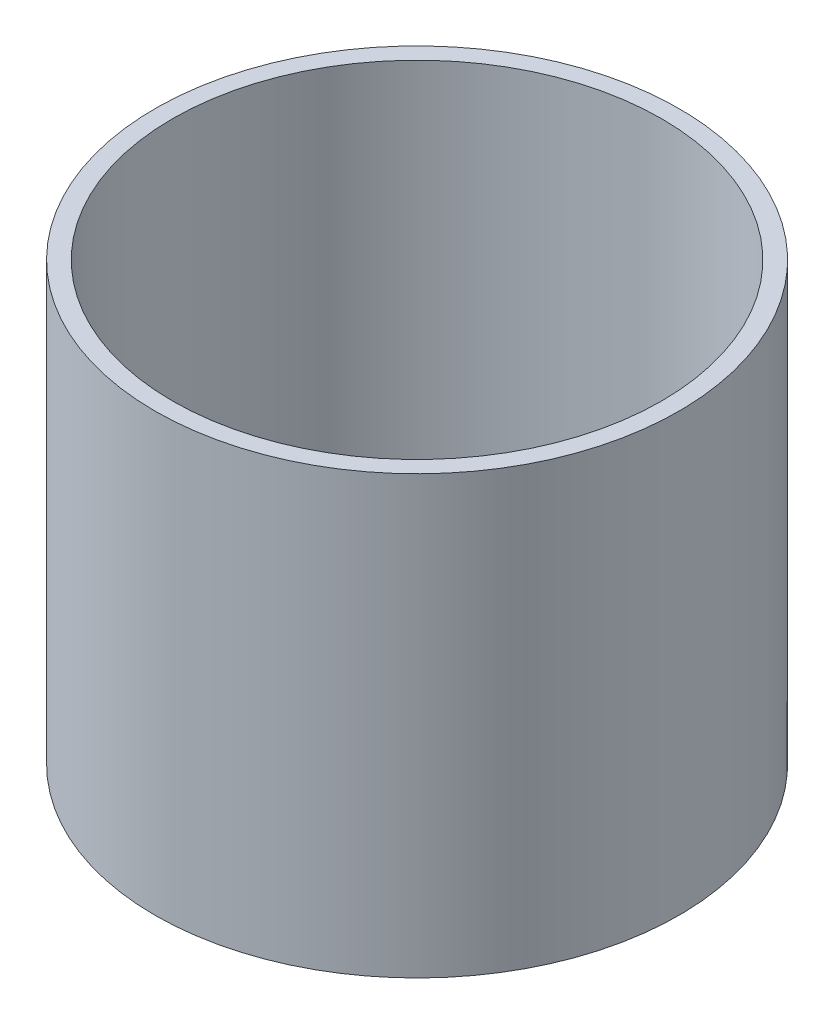
ISO-10303-21;
HEADER;
FILE_DESCRIPTION(('STEP AP214'),'2;1');
FILE_NAME('part.step','',(''),(''),'','','');
FILE_SCHEMA(('AUTOMOTIVE_DESIGN { 1 0 10303 214 1 1 1 1 }'));
ENDSEC;
DATA;
#1=APPLICATION_CONTEXT('core data for automotive mechanical design processes');
#2=APPLICATION_PROTOCOL_DEFINITION('international standard','automotive_design',2000,#1);
#3=PRODUCT_CONTEXT('',#1,'mechanical');
#4=PRODUCT('Part','Part','',(#3));
#5=PRODUCT_RELATED_PRODUCT_CATEGORY('part','',(#4));
#6=PRODUCT_DEFINITION_FORMATION('','',#4);
#7=PRODUCT_DEFINITION_CONTEXT('part definition',#1,'design');
#8=PRODUCT_DEFINITION('design','',#6,#7);
#9=PRODUCT_DEFINITION_SHAPE('','',#8);
#10=(LENGTH_UNIT() NAMED_UNIT(*) SI_UNIT(.MILLI.,.METRE.));
#11=(NAMED_UNIT(*) PLANE_ANGLE_UNIT() SI_UNIT($,.RADIAN.));
#12=(NAMED_UNIT(*) SI_UNIT($,.STERADIAN.) SOLID_ANGLE_UNIT());
#13=UNCERTAINTY_MEASURE_WITH_UNIT(LENGTH_MEASURE(1.E-05),#10,'distance_accuracy_value','');
#14=(GEOMETRIC_REPRESENTATION_CONTEXT(3) GLOBAL_UNCERTAINTY_ASSIGNED_CONTEXT((#13)) GLOBAL_UNIT_ASSIGNED_CONTEXT((#10,
#11,#12)) REPRESENTATION_CONTEXT('',''));
#15=CARTESIAN_POINT('',(0.,0.,0.));
#16=DIRECTION('',(0.,0.,1.));
#17=DIRECTION('',(1.,0.,0.));
#18=AXIS2_PLACEMENT_3D('',#15,#16,#17);
#19=CARTESIAN_POINT('',(0.,50.,0.));
#20=DIRECTION('',(0.,1.,0.));
#21=DIRECTION('',(0.,0.,1.));
#22=AXIS2_PLACEMENT_3D('',#19,#20,#21);
#23=PLANE('',#22);
#24=CARTESIAN_POINT('',(0.,50.,0.));
#25=DIRECTION('',(0.,1.,0.));
#26=DIRECTION('',(0.,0.,1.));
#27=AXIS2_PLACEMENT_3D('',#24,#25,#26);
#28=CIRCLE('',#27,30.);
#29=CARTESIAN_POINT('',(0.,50.,30.));
#30=VERTEX_POINT('',#29);
#31=EDGE_CURVE('E10',#30,#30,#28,.T.);
#32=ORIENTED_EDGE('',*,*,#31,.T.);
#33=EDGE_LOOP('',(#32));
#34=FACE_BOUND('',#33,.T.);
#35=CARTESIAN_POINT('',(0.,50.,0.));
#36=DIRECTION('',(0.,1.,0.));
#37=DIRECTION('',(0.,0.,1.));
#38=AXIS2_PLACEMENT_3D('',#35,#36,#37);
#39=CIRCLE('',#38,28.);
#40=CARTESIAN_POINT('',(0.,50.,28.));
#41=VERTEX_POINT('',#40);
#42=EDGE_CURVE('E46',#41,#41,#39,.T.);
#43=ORIENTED_EDGE('',*,*,#42,.F.);
#44=EDGE_LOOP('',(#43));
#45=FACE_BOUND('',#44,.T.);
#46=ADVANCED_FACE('F35',(#34,#45),#23,.T.);
#47=CARTESIAN_POINT('',(0.,0.,0.));
#48=DIRECTION('',(0.,1.,0.));
#49=DIRECTION('',(0.,0.,1.));
#50=AXIS2_PLACEMENT_3D('',#47,#48,#49);
#51=PLANE('',#50);
#52=CARTESIAN_POINT('',(0.,0.,0.));
#53=DIRECTION('',(0.,1.,0.));
#54=DIRECTION('',(0.,0.,1.));
#55=AXIS2_PLACEMENT_3D('',#52,#53,#54);
#56=CIRCLE('',#55,30.);
#57=CARTESIAN_POINT('',(0.,0.,30.));
#58=VERTEX_POINT('',#57);
#59=EDGE_CURVE('E39',#58,#58,#56,.T.);
#60=ORIENTED_EDGE('',*,*,#59,.F.);
#61=EDGE_LOOP('',(#60));
#62=FACE_BOUND('',#61,.T.);
#63=CARTESIAN_POINT('',(0.,0.,0.));
#64=DIRECTION('',(0.,1.,0.));
#65=DIRECTION('',(0.,0.,1.));
#66=AXIS2_PLACEMENT_3D('',#63,#64,#65);
#67=CIRCLE('',#66,28.);
#68=CARTESIAN_POINT('',(0.,0.,28.));
#69=VERTEX_POINT('',#68);
#70=EDGE_CURVE('E48',#69,#69,#67,.T.);
#71=ORIENTED_EDGE('',*,*,#70,.T.);
#72=EDGE_LOOP('',(#71));
#73=FACE_BOUND('',#72,.T.);
#74=ADVANCED_FACE('F58',(#62,#73),#51,.F.);
#75=CARTESIAN_POINT('',(0.,50.,0.));
#76=DIRECTION('',(0.,-1.,0.));
#77=DIRECTION('',(0.,0.,-1.));
#78=AXIS2_PLACEMENT_3D('',#75,#76,#77);
#79=CYLINDRICAL_SURFACE('',#78,30.);
#80=ORIENTED_EDGE('',*,*,#31,.F.);
#81=EDGE_LOOP('',(#80));
#82=FACE_BOUND('',#81,.T.);
#83=ORIENTED_EDGE('',*,*,#59,.T.);
#84=EDGE_LOOP('',(#83));
#85=FACE_BOUND('',#84,.T.);
#86=ADVANCED_FACE('F37',(#82,#85),#79,.T.);
#87=CARTESIAN_POINT('',(0.,50.,0.));
#88=DIRECTION('',(0.,-1.,0.));
#89=DIRECTION('',(0.,0.,-1.));
#90=AXIS2_PLACEMENT_3D('',#87,#88,#89);
#91=CYLINDRICAL_SURFACE('',#90,28.);
#92=ORIENTED_EDGE('',*,*,#42,.T.);
#93=EDGE_LOOP('',(#92));
#94=FACE_BOUND('',#93,.T.);
#95=ORIENTED_EDGE('',*,*,#70,.F.);
#96=EDGE_LOOP('',(#95));
#97=FACE_BOUND('',#96,.T.);
#98=ADVANCED_FACE('F54',(#94,#97),#91,.F.);
#99=CLOSED_SHELL('',(#46,#74,#86,#98));
#100=MANIFOLD_SOLID_BREP('B2',#99);
#101=ADVANCED_BREP_SHAPE_REPRESENTATION('',(#18,#100),#14);
#102=SHAPE_DEFINITION_REPRESENTATION(#9,#101);
ENDSEC;
END-ISO-10303-21;
